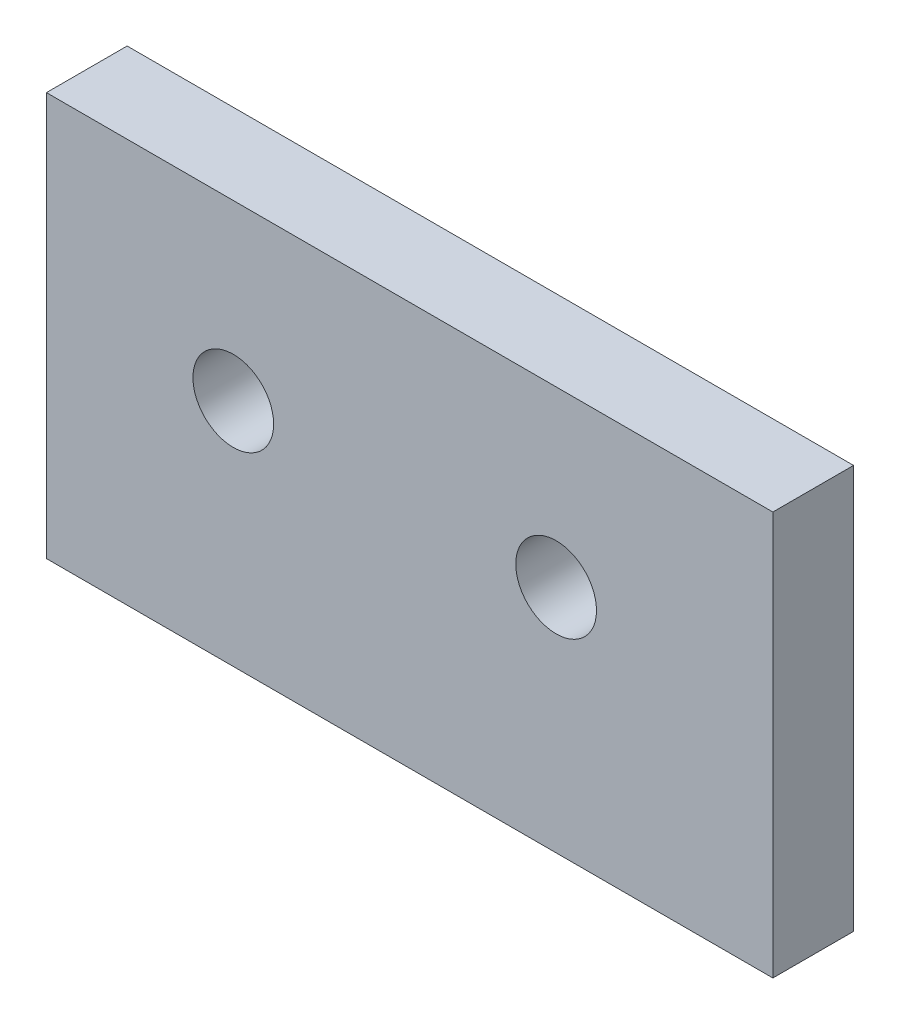
ISO-10303-21;
HEADER;
FILE_DESCRIPTION(('STEP AP214'),'2;1');
FILE_NAME('part.step','',(''),(''),'','','');
FILE_SCHEMA(('AUTOMOTIVE_DESIGN { 1 0 10303 214 1 1 1 1 }'));
ENDSEC;
DATA;
#1=APPLICATION_CONTEXT('core data for automotive mechanical design processes');
#2=APPLICATION_PROTOCOL_DEFINITION('international standard','automotive_design',2000,#1);
#3=PRODUCT_CONTEXT('',#1,'mechanical');
#4=PRODUCT('Part','Part','',(#3));
#5=PRODUCT_RELATED_PRODUCT_CATEGORY('part','',(#4));
#6=PRODUCT_DEFINITION_FORMATION('','',#4);
#7=PRODUCT_DEFINITION_CONTEXT('part definition',#1,'design');
#8=PRODUCT_DEFINITION('design','',#6,#7);
#9=PRODUCT_DEFINITION_SHAPE('','',#8);
#10=(LENGTH_UNIT() NAMED_UNIT(*) SI_UNIT(.MILLI.,.METRE.));
#11=(NAMED_UNIT(*) PLANE_ANGLE_UNIT() SI_UNIT($,.RADIAN.));
#12=(NAMED_UNIT(*) SI_UNIT($,.STERADIAN.) SOLID_ANGLE_UNIT());
#13=UNCERTAINTY_MEASURE_WITH_UNIT(LENGTH_MEASURE(1.E-05),#10,'distance_accuracy_value','');
#14=(GEOMETRIC_REPRESENTATION_CONTEXT(3) GLOBAL_UNCERTAINTY_ASSIGNED_CONTEXT((#13)) GLOBAL_UNIT_ASSIGNED_CONTEXT((#10,
#11,#12)) REPRESENTATION_CONTEXT('',''));
#15=CARTESIAN_POINT('',(0.,0.,0.));
#16=DIRECTION('',(0.,0.,1.));
#17=DIRECTION('',(1.,0.,0.));
#18=AXIS2_PLACEMENT_3D('',#15,#16,#17);
#19=CARTESIAN_POINT('',(0.,0.,10.));
#20=DIRECTION('',(0.,0.,-1.));
#21=DIRECTION('',(-1.,0.,0.));
#22=AXIS2_PLACEMENT_3D('',#19,#20,#21);
#23=PLANE('',#22);
#24=DIRECTION('',(0.,-1.,0.));
#25=VECTOR('',#24,1.);
#26=CARTESIAN_POINT('',(0.,0.,10.));
#27=LINE('',#26,#25);
#28=CARTESIAN_POINT('',(0.,50.,10.));
#29=VERTEX_POINT('',#28);
#30=CARTESIAN_POINT('',(0.,0.,10.));
#31=VERTEX_POINT('',#30);
#32=EDGE_CURVE('E96',#29,#31,#27,.T.);
#33=ORIENTED_EDGE('',*,*,#32,.T.);
#34=DIRECTION('',(1.,0.,0.));
#35=VECTOR('',#34,1.);
#36=CARTESIAN_POINT('',(0.,0.,10.));
#37=LINE('',#36,#35);
#38=CARTESIAN_POINT('',(90.,0.,10.));
#39=VERTEX_POINT('',#38);
#40=EDGE_CURVE('E91',#31,#39,#37,.T.);
#41=ORIENTED_EDGE('',*,*,#40,.T.);
#42=DIRECTION('',(0.,1.,0.));
#43=VECTOR('',#42,1.);
#44=CARTESIAN_POINT('',(90.,0.,10.));
#45=LINE('',#44,#43);
#46=CARTESIAN_POINT('',(90.,50.,10.));
#47=VERTEX_POINT('',#46);
#48=EDGE_CURVE('E94',#39,#47,#45,.T.);
#49=ORIENTED_EDGE('',*,*,#48,.T.);
#50=DIRECTION('',(-1.,0.,0.));
#51=VECTOR('',#50,1.);
#52=CARTESIAN_POINT('',(0.,50.,10.));
#53=LINE('',#52,#51);
#54=EDGE_CURVE('E61',#47,#29,#53,.T.);
#55=ORIENTED_EDGE('',*,*,#54,.T.);
#56=EDGE_LOOP('',(#33,#41,#49,#55));
#57=FACE_BOUND('',#56,.T.);
#58=CARTESIAN_POINT('',(23.15,28.5,10.));
#59=DIRECTION('',(0.,0.,1.));
#60=DIRECTION('',(1.,0.,0.));
#61=AXIS2_PLACEMENT_3D('',#58,#59,#60);
#62=CIRCLE('',#61,5.);
#63=CARTESIAN_POINT('',(28.15,28.5,10.));
#64=VERTEX_POINT('',#63);
#65=EDGE_CURVE('E116',#64,#64,#62,.T.);
#66=ORIENTED_EDGE('',*,*,#65,.F.);
#67=EDGE_LOOP('',(#66));
#68=FACE_BOUND('',#67,.T.);
#69=CARTESIAN_POINT('',(63.15,28.5,10.));
#70=DIRECTION('',(0.,0.,1.));
#71=DIRECTION('',(1.,0.,0.));
#72=AXIS2_PLACEMENT_3D('',#69,#70,#71);
#73=CIRCLE('',#72,5.);
#74=CARTESIAN_POINT('',(68.15,28.5,10.));
#75=VERTEX_POINT('',#74);
#76=EDGE_CURVE('E138',#75,#75,#73,.T.);
#77=ORIENTED_EDGE('',*,*,#76,.F.);
#78=EDGE_LOOP('',(#77));
#79=FACE_BOUND('',#78,.T.);
#80=ADVANCED_FACE('F43',(#57,#68,#79),#23,.F.);
#81=CARTESIAN_POINT('',(0.,0.,0.));
#82=DIRECTION('',(0.,0.,-1.));
#83=DIRECTION('',(-1.,0.,0.));
#84=AXIS2_PLACEMENT_3D('',#81,#82,#83);
#85=PLANE('',#84);
#86=CARTESIAN_POINT('',(23.15,28.5,0.));
#87=DIRECTION('',(0.,0.,1.));
#88=DIRECTION('',(1.,0.,0.));
#89=AXIS2_PLACEMENT_3D('',#86,#87,#88);
#90=CIRCLE('',#89,5.);
#91=CARTESIAN_POINT('',(28.15,28.5,0.));
#92=VERTEX_POINT('',#91);
#93=EDGE_CURVE('E134',#92,#92,#90,.T.);
#94=ORIENTED_EDGE('',*,*,#93,.T.);
#95=EDGE_LOOP('',(#94));
#96=FACE_BOUND('',#95,.T.);
#97=DIRECTION('',(0.,-1.,0.));
#98=VECTOR('',#97,1.);
#99=CARTESIAN_POINT('',(0.,0.,0.));
#100=LINE('',#99,#98);
#101=CARTESIAN_POINT('',(0.,50.,0.));
#102=VERTEX_POINT('',#101);
#103=CARTESIAN_POINT('',(0.,0.,0.));
#104=VERTEX_POINT('',#103);
#105=EDGE_CURVE('E112',#102,#104,#100,.T.);
#106=ORIENTED_EDGE('',*,*,#105,.F.);
#107=DIRECTION('',(-1.,0.,0.));
#108=VECTOR('',#107,1.);
#109=CARTESIAN_POINT('',(0.,50.,0.));
#110=LINE('',#109,#108);
#111=CARTESIAN_POINT('',(90.,50.,0.));
#112=VERTEX_POINT('',#111);
#113=EDGE_CURVE('E84',#112,#102,#110,.T.);
#114=ORIENTED_EDGE('',*,*,#113,.F.);
#115=DIRECTION('',(0.,1.,0.));
#116=VECTOR('',#115,1.);
#117=CARTESIAN_POINT('',(90.,0.,0.));
#118=LINE('',#117,#116);
#119=CARTESIAN_POINT('',(90.,0.,0.));
#120=VERTEX_POINT('',#119);
#121=EDGE_CURVE('E78',#120,#112,#118,.T.);
#122=ORIENTED_EDGE('',*,*,#121,.F.);
#123=DIRECTION('',(1.,0.,0.));
#124=VECTOR('',#123,1.);
#125=CARTESIAN_POINT('',(0.,0.,0.));
#126=LINE('',#125,#124);
#127=EDGE_CURVE('E101',#104,#120,#126,.T.);
#128=ORIENTED_EDGE('',*,*,#127,.F.);
#129=EDGE_LOOP('',(#106,#114,#122,#128));
#130=FACE_BOUND('',#129,.T.);
#131=CARTESIAN_POINT('',(63.15,28.5,0.));
#132=DIRECTION('',(0.,0.,1.));
#133=DIRECTION('',(1.,0.,0.));
#134=AXIS2_PLACEMENT_3D('',#131,#132,#133);
#135=CIRCLE('',#134,5.);
#136=CARTESIAN_POINT('',(68.15,28.5,0.));
#137=VERTEX_POINT('',#136);
#138=EDGE_CURVE('E142',#137,#137,#135,.T.);
#139=ORIENTED_EDGE('',*,*,#138,.T.);
#140=EDGE_LOOP('',(#139));
#141=FACE_BOUND('',#140,.T.);
#142=ADVANCED_FACE('F129',(#96,#130,#141),#85,.T.);
#143=CARTESIAN_POINT('',(0.,0.,10.));
#144=DIRECTION('',(1.,0.,0.));
#145=DIRECTION('',(0.,1.,0.));
#146=AXIS2_PLACEMENT_3D('',#143,#144,#145);
#147=PLANE('',#146);
#148=ORIENTED_EDGE('',*,*,#105,.T.);
#149=DIRECTION('',(0.,0.,-1.));
#150=VECTOR('',#149,1.);
#151=CARTESIAN_POINT('',(0.,0.,10.));
#152=LINE('',#151,#150);
#153=EDGE_CURVE('E11',#31,#104,#152,.T.);
#154=ORIENTED_EDGE('',*,*,#153,.F.);
#155=ORIENTED_EDGE('',*,*,#32,.F.);
#156=DIRECTION('',(0.,0.,-1.));
#157=VECTOR('',#156,1.);
#158=CARTESIAN_POINT('',(0.,50.,10.));
#159=LINE('',#158,#157);
#160=EDGE_CURVE('E108',#29,#102,#159,.T.);
#161=ORIENTED_EDGE('',*,*,#160,.T.);
#162=EDGE_LOOP('',(#148,#154,#155,#161));
#163=FACE_BOUND('',#162,.T.);
#164=ADVANCED_FACE('F45',(#163),#147,.F.);
#165=CARTESIAN_POINT('',(0.,0.,10.));
#166=DIRECTION('',(0.,1.,0.));
#167=DIRECTION('',(0.,0.,1.));
#168=AXIS2_PLACEMENT_3D('',#165,#166,#167);
#169=PLANE('',#168);
#170=ORIENTED_EDGE('',*,*,#127,.T.);
#171=DIRECTION('',(0.,0.,-1.));
#172=VECTOR('',#171,1.);
#173=CARTESIAN_POINT('',(90.,0.,10.));
#174=LINE('',#173,#172);
#175=EDGE_CURVE('E53',#39,#120,#174,.T.);
#176=ORIENTED_EDGE('',*,*,#175,.F.);
#177=ORIENTED_EDGE('',*,*,#40,.F.);
#178=ORIENTED_EDGE('',*,*,#153,.T.);
#179=EDGE_LOOP('',(#170,#176,#177,#178));
#180=FACE_BOUND('',#179,.T.);
#181=ADVANCED_FACE('F100',(#180),#169,.F.);
#182=CARTESIAN_POINT('',(90.,0.,10.));
#183=DIRECTION('',(-1.,0.,0.));
#184=DIRECTION('',(0.,-1.,0.));
#185=AXIS2_PLACEMENT_3D('',#182,#183,#184);
#186=PLANE('',#185);
#187=ORIENTED_EDGE('',*,*,#121,.T.);
#188=DIRECTION('',(0.,0.,-1.));
#189=VECTOR('',#188,1.);
#190=CARTESIAN_POINT('',(90.,50.,10.));
#191=LINE('',#190,#189);
#192=EDGE_CURVE('E103',#47,#112,#191,.T.);
#193=ORIENTED_EDGE('',*,*,#192,.F.);
#194=ORIENTED_EDGE('',*,*,#48,.F.);
#195=ORIENTED_EDGE('',*,*,#175,.T.);
#196=EDGE_LOOP('',(#187,#193,#194,#195));
#197=FACE_BOUND('',#196,.T.);
#198=ADVANCED_FACE('F104',(#197),#186,.F.);
#199=CARTESIAN_POINT('',(0.,50.,10.));
#200=DIRECTION('',(0.,-1.,0.));
#201=DIRECTION('',(0.,0.,-1.));
#202=AXIS2_PLACEMENT_3D('',#199,#200,#201);
#203=PLANE('',#202);
#204=ORIENTED_EDGE('',*,*,#113,.T.);
#205=ORIENTED_EDGE('',*,*,#160,.F.);
#206=ORIENTED_EDGE('',*,*,#54,.F.);
#207=ORIENTED_EDGE('',*,*,#192,.T.);
#208=EDGE_LOOP('',(#204,#205,#206,#207));
#209=FACE_BOUND('',#208,.T.);
#210=ADVANCED_FACE('F126',(#209),#203,.F.);
#211=CARTESIAN_POINT('',(23.15,28.5,10.));
#212=DIRECTION('',(0.,0.,-1.));
#213=DIRECTION('',(-1.,0.,0.));
#214=AXIS2_PLACEMENT_3D('',#211,#212,#213);
#215=CYLINDRICAL_SURFACE('',#214,5.);
#216=ORIENTED_EDGE('',*,*,#65,.T.);
#217=EDGE_LOOP('',(#216));
#218=FACE_BOUND('',#217,.T.);
#219=ORIENTED_EDGE('',*,*,#93,.F.);
#220=EDGE_LOOP('',(#219));
#221=FACE_BOUND('',#220,.T.);
#222=ADVANCED_FACE('F161',(#218,#221),#215,.F.);
#223=CARTESIAN_POINT('',(63.15,28.5,10.));
#224=DIRECTION('',(0.,0.,-1.));
#225=DIRECTION('',(-1.,0.,0.));
#226=AXIS2_PLACEMENT_3D('',#223,#224,#225);
#227=CYLINDRICAL_SURFACE('',#226,5.);
#228=ORIENTED_EDGE('',*,*,#76,.T.);
#229=EDGE_LOOP('',(#228));
#230=FACE_BOUND('',#229,.T.);
#231=ORIENTED_EDGE('',*,*,#138,.F.);
#232=EDGE_LOOP('',(#231));
#233=FACE_BOUND('',#232,.T.);
#234=ADVANCED_FACE('F150',(#230,#233),#227,.F.);
#235=CLOSED_SHELL('',(#80,#142,#164,#181,#198,#210,#222,#234));
#236=MANIFOLD_SOLID_BREP('B2',#235);
#237=ADVANCED_BREP_SHAPE_REPRESENTATION('',(#18,#236),#14);
#238=SHAPE_DEFINITION_REPRESENTATION(#9,#237);
ENDSEC;
END-ISO-10303-21;
